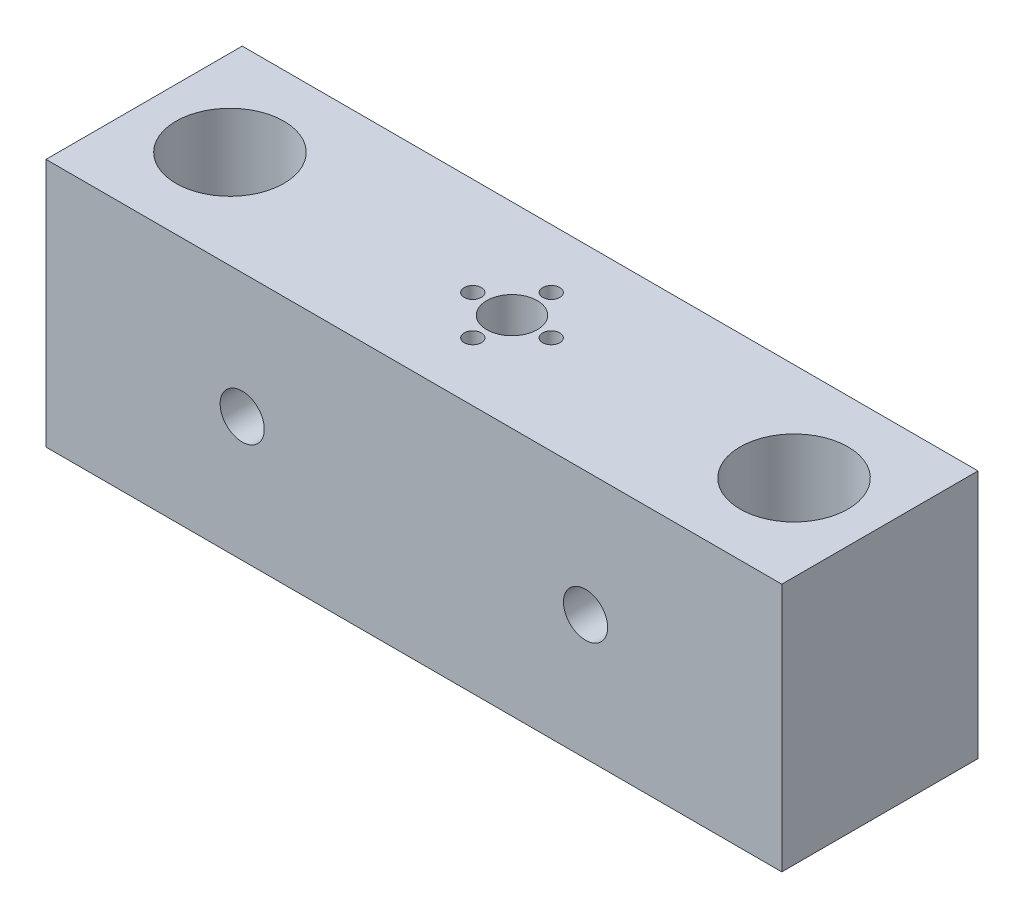
ISO-10303-21;
HEADER;
FILE_DESCRIPTION(('STEP AP214'),'2;1');
FILE_NAME('part.step','',(''),(''),'','','');
FILE_SCHEMA(('AUTOMOTIVE_DESIGN { 1 0 10303 214 1 1 1 1 }'));
ENDSEC;
DATA;
#1=APPLICATION_CONTEXT('core data for automotive mechanical design processes');
#2=APPLICATION_PROTOCOL_DEFINITION('international standard','automotive_design',2000,#1);
#3=PRODUCT_CONTEXT('',#1,'mechanical');
#4=PRODUCT('Part','Part','',(#3));
#5=PRODUCT_RELATED_PRODUCT_CATEGORY('part','',(#4));
#6=PRODUCT_DEFINITION_FORMATION('','',#4);
#7=PRODUCT_DEFINITION_CONTEXT('part definition',#1,'design');
#8=PRODUCT_DEFINITION('design','',#6,#7);
#9=PRODUCT_DEFINITION_SHAPE('','',#8);
#10=(LENGTH_UNIT() NAMED_UNIT(*) SI_UNIT(.MILLI.,.METRE.));
#11=(NAMED_UNIT(*) PLANE_ANGLE_UNIT() SI_UNIT($,.RADIAN.));
#12=(NAMED_UNIT(*) SI_UNIT($,.STERADIAN.) SOLID_ANGLE_UNIT());
#13=UNCERTAINTY_MEASURE_WITH_UNIT(LENGTH_MEASURE(1.E-05),#10,'distance_accuracy_value','');
#14=(GEOMETRIC_REPRESENTATION_CONTEXT(3) GLOBAL_UNCERTAINTY_ASSIGNED_CONTEXT((#13)) GLOBAL_UNIT_ASSIGNED_CONTEXT((#10,
#11,#12)) REPRESENTATION_CONTEXT('',''));
#15=CARTESIAN_POINT('',(0.,0.,0.));
#16=DIRECTION('',(0.,0.,1.));
#17=DIRECTION('',(1.,0.,0.));
#18=AXIS2_PLACEMENT_3D('',#15,#16,#17);
#19=CARTESIAN_POINT('',(0.,50.8,0.));
#20=DIRECTION('',(0.,1.,0.));
#21=DIRECTION('',(0.,0.,1.));
#22=AXIS2_PLACEMENT_3D('',#19,#20,#21);
#23=PLANE('',#22);
#24=CARTESIAN_POINT('',(-8.,50.8,0.));
#25=DIRECTION('',(0.,1.,0.));
#26=DIRECTION('',(1.,0.,0.));
#27=AXIS2_PLACEMENT_3D('',#24,#25,#26);
#28=CIRCLE('',#27,1.75);
#29=CARTESIAN_POINT('',(-6.25,50.8,0.));
#30=VERTEX_POINT('',#29);
#31=EDGE_CURVE('E155',#30,#30,#28,.T.);
#32=ORIENTED_EDGE('',*,*,#31,.F.);
#33=EDGE_LOOP('',(#32));
#34=FACE_BOUND('',#33,.T.);
#35=CARTESIAN_POINT('',(0.,50.8,8.));
#36=DIRECTION('',(0.,1.,0.));
#37=DIRECTION('',(0.,0.,-1.));
#38=AXIS2_PLACEMENT_3D('',#35,#36,#37);
#39=CIRCLE('',#38,1.75);
#40=CARTESIAN_POINT('',(0.,50.8,6.25));
#41=VERTEX_POINT('',#40);
#42=EDGE_CURVE('E149',#41,#41,#39,.T.);
#43=ORIENTED_EDGE('',*,*,#42,.F.);
#44=EDGE_LOOP('',(#43));
#45=FACE_BOUND('',#44,.T.);
#46=CARTESIAN_POINT('',(8.,50.8,0.));
#47=DIRECTION('',(0.,1.,0.));
#48=DIRECTION('',(-1.,0.,0.));
#49=AXIS2_PLACEMENT_3D('',#46,#47,#48);
#50=CIRCLE('',#49,1.75);
#51=CARTESIAN_POINT('',(6.25,50.8,0.));
#52=VERTEX_POINT('',#51);
#53=EDGE_CURVE('E142',#52,#52,#50,.T.);
#54=ORIENTED_EDGE('',*,*,#53,.F.);
#55=EDGE_LOOP('',(#54));
#56=FACE_BOUND('',#55,.T.);
#57=CARTESIAN_POINT('',(0.,50.8,-8.));
#58=DIRECTION('',(0.,1.,0.));
#59=DIRECTION('',(0.,0.,1.));
#60=AXIS2_PLACEMENT_3D('',#57,#58,#59);
#61=CIRCLE('',#60,1.75);
#62=CARTESIAN_POINT('',(0.,50.8,-6.25));
#63=VERTEX_POINT('',#62);
#64=EDGE_CURVE('E136',#63,#63,#61,.T.);
#65=ORIENTED_EDGE('',*,*,#64,.F.);
#66=EDGE_LOOP('',(#65));
#67=FACE_BOUND('',#66,.T.);
#68=CARTESIAN_POINT('',(-57.5,50.8,0.));
#69=DIRECTION('',(0.,1.,0.));
#70=DIRECTION('',(0.,0.,1.));
#71=AXIS2_PLACEMENT_3D('',#68,#69,#70);
#72=CIRCLE('',#71,11.);
#73=CARTESIAN_POINT('',(-57.5,50.8,-11.));
#74=VERTEX_POINT('',#73);
#75=EDGE_CURVE('E123',#74,#74,#72,.F.);
#76=ORIENTED_EDGE('',*,*,#75,.T.);
#77=EDGE_LOOP('',(#76));
#78=FACE_BOUND('',#77,.T.);
#79=DIRECTION('',(0.,0.,-1.));
#80=VECTOR('',#79,1.);
#81=CARTESIAN_POINT('',(75.,50.8,-20.));
#82=LINE('',#81,#80);
#83=CARTESIAN_POINT('',(75.,50.8,20.));
#84=VERTEX_POINT('',#83);
#85=CARTESIAN_POINT('',(75.,50.8,-20.));
#86=VERTEX_POINT('',#85);
#87=EDGE_CURVE('E91',#84,#86,#82,.T.);
#88=ORIENTED_EDGE('',*,*,#87,.T.);
#89=DIRECTION('',(-1.,0.,0.));
#90=VECTOR('',#89,1.);
#91=CARTESIAN_POINT('',(-75.,50.8,-20.));
#92=LINE('',#91,#90);
#93=CARTESIAN_POINT('',(-75.,50.8,-20.));
#94=VERTEX_POINT('',#93);
#95=EDGE_CURVE('E86',#86,#94,#92,.T.);
#96=ORIENTED_EDGE('',*,*,#95,.T.);
#97=DIRECTION('',(0.,0.,1.));
#98=VECTOR('',#97,1.);
#99=CARTESIAN_POINT('',(-75.,50.8,-20.));
#100=LINE('',#99,#98);
#101=CARTESIAN_POINT('',(-75.,50.8,20.));
#102=VERTEX_POINT('',#101);
#103=EDGE_CURVE('E89',#94,#102,#100,.T.);
#104=ORIENTED_EDGE('',*,*,#103,.T.);
#105=DIRECTION('',(1.,0.,0.));
#106=VECTOR('',#105,1.);
#107=CARTESIAN_POINT('',(-75.,50.8,20.));
#108=LINE('',#107,#106);
#109=EDGE_CURVE('E56',#102,#84,#108,.T.);
#110=ORIENTED_EDGE('',*,*,#109,.T.);
#111=EDGE_LOOP('',(#88,#96,#104,#110));
#112=FACE_BOUND('',#111,.T.);
#113=CARTESIAN_POINT('',(0.,50.8,0.));
#114=DIRECTION('',(0.,1.,0.));
#115=DIRECTION('',(0.,0.,1.));
#116=AXIS2_PLACEMENT_3D('',#113,#114,#115);
#117=CIRCLE('',#116,5.15);
#118=CARTESIAN_POINT('',(0.,50.8,-5.15));
#119=VERTEX_POINT('',#118);
#120=EDGE_CURVE('E106',#119,#119,#117,.F.);
#121=ORIENTED_EDGE('',*,*,#120,.T.);
#122=EDGE_LOOP('',(#121));
#123=FACE_BOUND('',#122,.T.);
#124=CARTESIAN_POINT('',(57.5,50.8,0.));
#125=DIRECTION('',(0.,1.,0.));
#126=DIRECTION('',(0.,0.,1.));
#127=AXIS2_PLACEMENT_3D('',#124,#125,#126);
#128=CIRCLE('',#127,11.);
#129=CARTESIAN_POINT('',(57.5,50.8,-11.));
#130=VERTEX_POINT('',#129);
#131=EDGE_CURVE('E129',#130,#130,#128,.F.);
#132=ORIENTED_EDGE('',*,*,#131,.T.);
#133=EDGE_LOOP('',(#132));
#134=FACE_BOUND('',#133,.T.);
#135=ADVANCED_FACE('F39',(#34,#45,#56,#67,#78,#112,#123,#134),#23,.T.);
#136=CARTESIAN_POINT('',(0.,0.,0.));
#137=DIRECTION('',(0.,1.,0.));
#138=DIRECTION('',(0.,0.,1.));
#139=AXIS2_PLACEMENT_3D('',#136,#137,#138);
#140=PLANE('',#139);
#141=CARTESIAN_POINT('',(-8.,0.,0.));
#142=DIRECTION('',(0.,1.,0.));
#143=DIRECTION('',(1.,0.,0.));
#144=AXIS2_PLACEMENT_3D('',#141,#142,#143);
#145=CIRCLE('',#144,1.75);
#146=CARTESIAN_POINT('',(-6.25,0.,0.));
#147=VERTEX_POINT('',#146);
#148=EDGE_CURVE('E139',#147,#147,#145,.T.);
#149=ORIENTED_EDGE('',*,*,#148,.T.);
#150=EDGE_LOOP('',(#149));
#151=FACE_BOUND('',#150,.T.);
#152=CARTESIAN_POINT('',(0.,0.,8.));
#153=DIRECTION('',(0.,1.,0.));
#154=DIRECTION('',(0.,0.,-1.));
#155=AXIS2_PLACEMENT_3D('',#152,#153,#154);
#156=CIRCLE('',#155,1.75);
#157=CARTESIAN_POINT('',(0.,0.,6.25));
#158=VERTEX_POINT('',#157);
#159=EDGE_CURVE('E152',#158,#158,#156,.T.);
#160=ORIENTED_EDGE('',*,*,#159,.T.);
#161=EDGE_LOOP('',(#160));
#162=FACE_BOUND('',#161,.T.);
#163=CARTESIAN_POINT('',(8.,0.,0.));
#164=DIRECTION('',(0.,1.,0.));
#165=DIRECTION('',(-1.,0.,0.));
#166=AXIS2_PLACEMENT_3D('',#163,#164,#165);
#167=CIRCLE('',#166,1.75);
#168=CARTESIAN_POINT('',(6.25,0.,0.));
#169=VERTEX_POINT('',#168);
#170=EDGE_CURVE('E145',#169,#169,#167,.T.);
#171=ORIENTED_EDGE('',*,*,#170,.T.);
#172=EDGE_LOOP('',(#171));
#173=FACE_BOUND('',#172,.T.);
#174=CARTESIAN_POINT('',(0.,0.,-8.));
#175=DIRECTION('',(0.,1.,0.));
#176=DIRECTION('',(0.,0.,1.));
#177=AXIS2_PLACEMENT_3D('',#174,#175,#176);
#178=CIRCLE('',#177,1.75);
#179=CARTESIAN_POINT('',(0.,0.,-6.25));
#180=VERTEX_POINT('',#179);
#181=EDGE_CURVE('E135',#180,#180,#178,.T.);
#182=ORIENTED_EDGE('',*,*,#181,.T.);
#183=EDGE_LOOP('',(#182));
#184=FACE_BOUND('',#183,.T.);
#185=DIRECTION('',(0.,0.,-1.));
#186=VECTOR('',#185,1.);
#187=CARTESIAN_POINT('',(75.,0.,-20.));
#188=LINE('',#187,#186);
#189=CARTESIAN_POINT('',(75.,0.,20.));
#190=VERTEX_POINT('',#189);
#191=CARTESIAN_POINT('',(75.,0.,-20.));
#192=VERTEX_POINT('',#191);
#193=EDGE_CURVE('E103',#190,#192,#188,.T.);
#194=ORIENTED_EDGE('',*,*,#193,.F.);
#195=DIRECTION('',(1.,0.,0.));
#196=VECTOR('',#195,1.);
#197=CARTESIAN_POINT('',(-75.,0.,20.));
#198=LINE('',#197,#196);
#199=CARTESIAN_POINT('',(-75.,0.,20.));
#200=VERTEX_POINT('',#199);
#201=EDGE_CURVE('E79',#200,#190,#198,.T.);
#202=ORIENTED_EDGE('',*,*,#201,.F.);
#203=DIRECTION('',(0.,0.,1.));
#204=VECTOR('',#203,1.);
#205=CARTESIAN_POINT('',(-75.,0.,-20.));
#206=LINE('',#205,#204);
#207=CARTESIAN_POINT('',(-75.,0.,-20.));
#208=VERTEX_POINT('',#207);
#209=EDGE_CURVE('E73',#208,#200,#206,.T.);
#210=ORIENTED_EDGE('',*,*,#209,.F.);
#211=DIRECTION('',(-1.,0.,0.));
#212=VECTOR('',#211,1.);
#213=CARTESIAN_POINT('',(-75.,0.,-20.));
#214=LINE('',#213,#212);
#215=EDGE_CURVE('E95',#192,#208,#214,.T.);
#216=ORIENTED_EDGE('',*,*,#215,.F.);
#217=EDGE_LOOP('',(#194,#202,#210,#216));
#218=FACE_BOUND('',#217,.T.);
#219=CARTESIAN_POINT('',(0.,0.,0.));
#220=DIRECTION('',(0.,1.,0.));
#221=DIRECTION('',(0.,0.,1.));
#222=AXIS2_PLACEMENT_3D('',#219,#220,#221);
#223=CIRCLE('',#222,5.15);
#224=CARTESIAN_POINT('',(0.,0.,-5.15));
#225=VERTEX_POINT('',#224);
#226=EDGE_CURVE('E120',#225,#225,#223,.T.);
#227=ORIENTED_EDGE('',*,*,#226,.T.);
#228=EDGE_LOOP('',(#227));
#229=FACE_BOUND('',#228,.T.);
#230=CARTESIAN_POINT('',(-57.5,0.,0.));
#231=DIRECTION('',(0.,1.,0.));
#232=DIRECTION('',(0.,0.,1.));
#233=AXIS2_PLACEMENT_3D('',#230,#231,#232);
#234=CIRCLE('',#233,11.);
#235=CARTESIAN_POINT('',(-57.5,0.,-11.));
#236=VERTEX_POINT('',#235);
#237=EDGE_CURVE('E126',#236,#236,#234,.T.);
#238=ORIENTED_EDGE('',*,*,#237,.T.);
#239=EDGE_LOOP('',(#238));
#240=FACE_BOUND('',#239,.T.);
#241=CARTESIAN_POINT('',(57.5,0.,0.));
#242=DIRECTION('',(0.,1.,0.));
#243=DIRECTION('',(0.,0.,1.));
#244=AXIS2_PLACEMENT_3D('',#241,#242,#243);
#245=CIRCLE('',#244,11.);
#246=CARTESIAN_POINT('',(57.5,0.,-11.));
#247=VERTEX_POINT('',#246);
#248=EDGE_CURVE('E132',#247,#247,#245,.T.);
#249=ORIENTED_EDGE('',*,*,#248,.T.);
#250=EDGE_LOOP('',(#249));
#251=FACE_BOUND('',#250,.T.);
#252=ADVANCED_FACE('F114',(#151,#162,#173,#184,#218,#229,#240,#251),#140,.F.);
#253=CARTESIAN_POINT('',(75.,50.8,-20.));
#254=DIRECTION('',(-1.,0.,0.));
#255=DIRECTION('',(0.,0.,1.));
#256=AXIS2_PLACEMENT_3D('',#253,#254,#255);
#257=PLANE('',#256);
#258=ORIENTED_EDGE('',*,*,#193,.T.);
#259=DIRECTION('',(0.,-1.,0.));
#260=VECTOR('',#259,1.);
#261=CARTESIAN_POINT('',(75.,50.8,-20.));
#262=LINE('',#261,#260);
#263=EDGE_CURVE('E11',#86,#192,#262,.T.);
#264=ORIENTED_EDGE('',*,*,#263,.F.);
#265=ORIENTED_EDGE('',*,*,#87,.F.);
#266=DIRECTION('',(0.,-1.,0.));
#267=VECTOR('',#266,1.);
#268=CARTESIAN_POINT('',(75.,50.8,20.));
#269=LINE('',#268,#267);
#270=EDGE_CURVE('E99',#84,#190,#269,.T.);
#271=ORIENTED_EDGE('',*,*,#270,.T.);
#272=EDGE_LOOP('',(#258,#264,#265,#271));
#273=FACE_BOUND('',#272,.T.);
#274=ADVANCED_FACE('F41',(#273),#257,.F.);
#275=CARTESIAN_POINT('',(-75.,50.8,-20.));
#276=DIRECTION('',(0.,0.,1.));
#277=DIRECTION('',(1.,0.,0.));
#278=AXIS2_PLACEMENT_3D('',#275,#276,#277);
#279=PLANE('',#278);
#280=CARTESIAN_POINT('',(-35.,25.4,-20.));
#281=DIRECTION('',(0.,0.,-1.));
#282=DIRECTION('',(-1.,0.,0.));
#283=AXIS2_PLACEMENT_3D('',#280,#281,#282);
#284=CIRCLE('',#283,5.025);
#285=CARTESIAN_POINT('',(-40.025,25.4,-20.));
#286=VERTEX_POINT('',#285);
#287=EDGE_CURVE('E174',#286,#286,#284,.T.);
#288=ORIENTED_EDGE('',*,*,#287,.F.);
#289=EDGE_LOOP('',(#288));
#290=FACE_BOUND('',#289,.T.);
#291=CARTESIAN_POINT('',(35.,25.4,-20.));
#292=DIRECTION('',(0.,0.,-1.));
#293=DIRECTION('',(-1.,0.,0.));
#294=AXIS2_PLACEMENT_3D('',#291,#292,#293);
#295=CIRCLE('',#294,5.025);
#296=CARTESIAN_POINT('',(29.975,25.4,-20.));
#297=VERTEX_POINT('',#296);
#298=EDGE_CURVE('E165',#297,#297,#295,.T.);
#299=ORIENTED_EDGE('',*,*,#298,.F.);
#300=EDGE_LOOP('',(#299));
#301=FACE_BOUND('',#300,.T.);
#302=ORIENTED_EDGE('',*,*,#215,.T.);
#303=DIRECTION('',(0.,-1.,0.));
#304=VECTOR('',#303,1.);
#305=CARTESIAN_POINT('',(-75.,50.8,-20.));
#306=LINE('',#305,#304);
#307=EDGE_CURVE('E48',#94,#208,#306,.T.);
#308=ORIENTED_EDGE('',*,*,#307,.F.);
#309=ORIENTED_EDGE('',*,*,#95,.F.);
#310=ORIENTED_EDGE('',*,*,#263,.T.);
#311=EDGE_LOOP('',(#302,#308,#309,#310));
#312=FACE_BOUND('',#311,.T.);
#313=ADVANCED_FACE('F94',(#290,#301,#312),#279,.F.);
#314=CARTESIAN_POINT('',(-75.,50.8,-20.));
#315=DIRECTION('',(1.,0.,0.));
#316=DIRECTION('',(0.,0.,-1.));
#317=AXIS2_PLACEMENT_3D('',#314,#315,#316);
#318=PLANE('',#317);
#319=ORIENTED_EDGE('',*,*,#209,.T.);
#320=DIRECTION('',(0.,-1.,0.));
#321=VECTOR('',#320,1.);
#322=CARTESIAN_POINT('',(-75.,50.8,20.));
#323=LINE('',#322,#321);
#324=EDGE_CURVE('E96',#102,#200,#323,.T.);
#325=ORIENTED_EDGE('',*,*,#324,.F.);
#326=ORIENTED_EDGE('',*,*,#103,.F.);
#327=ORIENTED_EDGE('',*,*,#307,.T.);
#328=EDGE_LOOP('',(#319,#325,#326,#327));
#329=FACE_BOUND('',#328,.T.);
#330=ADVANCED_FACE('F97',(#329),#318,.F.);
#331=CARTESIAN_POINT('',(-75.,50.8,20.));
#332=DIRECTION('',(0.,0.,-1.));
#333=DIRECTION('',(-1.,0.,0.));
#334=AXIS2_PLACEMENT_3D('',#331,#332,#333);
#335=PLANE('',#334);
#336=CARTESIAN_POINT('',(-35.,25.4,20.));
#337=DIRECTION('',(0.,0.,-1.));
#338=DIRECTION('',(-1.,0.,0.));
#339=AXIS2_PLACEMENT_3D('',#336,#337,#338);
#340=CIRCLE('',#339,4.49999999999998);
#341=CARTESIAN_POINT('',(-39.5,25.4,20.));
#342=VERTEX_POINT('',#341);
#343=EDGE_CURVE('E168',#342,#342,#340,.T.);
#344=ORIENTED_EDGE('',*,*,#343,.T.);
#345=EDGE_LOOP('',(#344));
#346=FACE_BOUND('',#345,.T.);
#347=CARTESIAN_POINT('',(35.,25.4,20.));
#348=DIRECTION('',(0.,0.,-1.));
#349=DIRECTION('',(-1.,0.,0.));
#350=AXIS2_PLACEMENT_3D('',#347,#348,#349);
#351=CIRCLE('',#350,4.49999999999998);
#352=CARTESIAN_POINT('',(30.5,25.4,20.));
#353=VERTEX_POINT('',#352);
#354=EDGE_CURVE('E146',#353,#353,#351,.T.);
#355=ORIENTED_EDGE('',*,*,#354,.T.);
#356=EDGE_LOOP('',(#355));
#357=FACE_BOUND('',#356,.T.);
#358=ORIENTED_EDGE('',*,*,#201,.T.);
#359=ORIENTED_EDGE('',*,*,#270,.F.);
#360=ORIENTED_EDGE('',*,*,#109,.F.);
#361=ORIENTED_EDGE('',*,*,#324,.T.);
#362=EDGE_LOOP('',(#358,#359,#360,#361));
#363=FACE_BOUND('',#362,.T.);
#364=ADVANCED_FACE('F111',(#346,#357,#363),#335,.F.);
#365=CARTESIAN_POINT('',(0.,50.800012,0.));
#366=DIRECTION('',(0.,-1.,0.));
#367=DIRECTION('',(0.,0.,-1.));
#368=AXIS2_PLACEMENT_3D('',#365,#366,#367);
#369=CYLINDRICAL_SURFACE('',#368,5.15);
#370=CARTESIAN_POINT('',(0.,50.8,-5.15));
#371=CARTESIAN_POINT('',(0.,50.2708333333333,-5.15));
#372=CARTESIAN_POINT('',(0.,49.7416666666667,-5.15));
#373=CARTESIAN_POINT('',(0.,48.6833333333333,-5.15));
#374=CARTESIAN_POINT('',(0.,48.1541666666667,-5.15));
#375=CARTESIAN_POINT('',(0.,47.0958333333333,-5.15));
#376=CARTESIAN_POINT('',(0.,46.5666666666667,-5.15));
#377=CARTESIAN_POINT('',(0.,45.5083333333333,-5.15));
#378=CARTESIAN_POINT('',(0.,44.9791666666667,-5.15));
#379=CARTESIAN_POINT('',(0.,43.9208333333333,-5.15));
#380=CARTESIAN_POINT('',(0.,43.3916666666667,-5.15));
#381=CARTESIAN_POINT('',(0.,42.3333333333333,-5.15));
#382=CARTESIAN_POINT('',(0.,41.8041666666667,-5.15));
#383=CARTESIAN_POINT('',(0.,40.7458333333333,-5.15));
#384=CARTESIAN_POINT('',(0.,40.2166666666667,-5.15));
#385=CARTESIAN_POINT('',(0.,39.1583333333333,-5.15));
#386=CARTESIAN_POINT('',(0.,38.6291666666667,-5.15));
#387=CARTESIAN_POINT('',(0.,37.5708333333333,-5.15));
#388=CARTESIAN_POINT('',(0.,37.0416666666667,-5.15));
#389=CARTESIAN_POINT('',(0.,35.9833333333333,-5.15));
#390=CARTESIAN_POINT('',(0.,35.4541666666667,-5.15));
#391=CARTESIAN_POINT('',(0.,34.3958333333333,-5.15));
#392=CARTESIAN_POINT('',(0.,33.8666666666667,-5.15));
#393=CARTESIAN_POINT('',(0.,32.8083333333333,-5.15));
#394=CARTESIAN_POINT('',(0.,32.2791666666667,-5.15));
#395=CARTESIAN_POINT('',(0.,31.2208333333333,-5.15));
#396=CARTESIAN_POINT('',(0.,30.6916666666667,-5.15));
#397=CARTESIAN_POINT('',(0.,29.6333333333333,-5.15));
#398=CARTESIAN_POINT('',(0.,29.1041666666667,-5.15));
#399=CARTESIAN_POINT('',(0.,28.0458333333333,-5.15));
#400=CARTESIAN_POINT('',(0.,27.5166666666667,-5.15));
#401=CARTESIAN_POINT('',(0.,26.4583333333333,-5.15));
#402=CARTESIAN_POINT('',(0.,25.9291666666667,-5.15));
#403=CARTESIAN_POINT('',(0.,24.8708333333333,-5.15));
#404=CARTESIAN_POINT('',(0.,24.3416666666667,-5.15));
#405=CARTESIAN_POINT('',(0.,23.2833333333333,-5.15));
#406=CARTESIAN_POINT('',(0.,22.7541666666667,-5.15));
#407=CARTESIAN_POINT('',(0.,21.6958333333333,-5.15));
#408=CARTESIAN_POINT('',(0.,21.1666666666667,-5.15));
#409=CARTESIAN_POINT('',(0.,20.1083333333333,-5.15));
#410=CARTESIAN_POINT('',(0.,19.5791666666667,-5.15));
#411=CARTESIAN_POINT('',(0.,18.5208333333333,-5.15));
#412=CARTESIAN_POINT('',(0.,17.9916666666667,-5.15));
#413=CARTESIAN_POINT('',(0.,16.9333333333333,-5.15));
#414=CARTESIAN_POINT('',(0.,16.4041666666667,-5.15));
#415=CARTESIAN_POINT('',(0.,15.3458333333333,-5.15));
#416=CARTESIAN_POINT('',(0.,14.8166666666667,-5.15));
#417=CARTESIAN_POINT('',(0.,13.7583333333333,-5.15));
#418=CARTESIAN_POINT('',(0.,13.2291666666667,-5.15));
#419=CARTESIAN_POINT('',(0.,12.1708333333333,-5.15));
#420=CARTESIAN_POINT('',(0.,11.6416666666667,-5.15));
#421=CARTESIAN_POINT('',(0.,10.5833333333333,-5.15));
#422=CARTESIAN_POINT('',(0.,10.0541666666667,-5.15));
#423=CARTESIAN_POINT('',(0.,8.99583333333333,-5.15));
#424=CARTESIAN_POINT('',(0.,8.46666666666667,-5.15));
#425=CARTESIAN_POINT('',(0.,7.40833333333333,-5.15));
#426=CARTESIAN_POINT('',(0.,6.87916666666667,-5.15));
#427=CARTESIAN_POINT('',(0.,5.82083333333333,-5.15));
#428=CARTESIAN_POINT('',(0.,5.29166666666667,-5.15));
#429=CARTESIAN_POINT('',(0.,4.23333333333333,-5.15));
#430=CARTESIAN_POINT('',(0.,3.70416666666667,-5.15));
#431=CARTESIAN_POINT('',(0.,2.64583333333333,-5.15));
#432=CARTESIAN_POINT('',(0.,2.11666666666666,-5.15));
#433=CARTESIAN_POINT('',(0.,1.05833333333333,-5.15));
#434=CARTESIAN_POINT('',(0.,0.529166666666666,-5.15));
#435=CARTESIAN_POINT('',(0.,0.,-5.15));
#436=B_SPLINE_CURVE_WITH_KNOTS('',3,(#370,#371,#372,#373,#374,#375,#376,#377,#378,#379,#380,
#381,#382,#383,#384,#385,#386,#387,#388,#389,#390,#391,#392,#393,#394,#395,#396,#397,#398,#399,
#400,#401,#402,#403,#404,#405,#406,#407,#408,#409,#410,#411,#412,#413,#414,#415,#416,#417,#418,
#419,#420,#421,#422,#423,#424,#425,#426,#427,#428,#429,#430,#431,#432,#433,#434,#435),
.UNSPECIFIED.,.F.,.F.,(4,2,2,2,2,2,2,2,2,2,2,2,2,2,2,2,2,2,2,2,2,2,2,2,2,2,2,2,2,2,2,2,4),(0.,
1.5875,3.175,4.7625,6.34999999999999,7.93749999999999,9.52499999999999,11.1125,12.7,14.2875,
15.875,17.4625,19.05,20.6375,22.225,23.8125,25.4,26.9875,28.575,30.1625,31.75,33.3375,34.925,
36.5125,38.1,39.6875,41.275,42.8625,44.45,46.0375,47.625,49.2125,50.8),.UNSPECIFIED.);
#437=EDGE_CURVE('BSEAM211',#119,#225,#436,.T.);
#438=ORIENTED_EDGE('',*,*,#120,.F.);
#439=ORIENTED_EDGE('',*,*,#226,.F.);
#440=ORIENTED_EDGE('',*,*,#437,.T.);
#441=ORIENTED_EDGE('',*,*,#437,.F.);
#442=EDGE_LOOP('',(#438,#440,#439,#441));
#443=FACE_BOUND('',#442,.T.);
#444=ADVANCED_FACE('F211',(#443),#369,.F.);
#445=CARTESIAN_POINT('',(-57.5,50.800012,0.));
#446=DIRECTION('',(0.,-1.,0.));
#447=DIRECTION('',(0.,0.,-1.));
#448=AXIS2_PLACEMENT_3D('',#445,#446,#447);
#449=CYLINDRICAL_SURFACE('',#448,11.);
#450=CARTESIAN_POINT('',(-57.5,50.8,-11.));
#451=CARTESIAN_POINT('',(-57.5,50.2708333333333,-11.));
#452=CARTESIAN_POINT('',(-57.5,49.7416666666667,-11.));
#453=CARTESIAN_POINT('',(-57.5,48.6833333333333,-11.));
#454=CARTESIAN_POINT('',(-57.5,48.1541666666667,-11.));
#455=CARTESIAN_POINT('',(-57.5,47.0958333333333,-11.));
#456=CARTESIAN_POINT('',(-57.5,46.5666666666667,-11.));
#457=CARTESIAN_POINT('',(-57.5,45.5083333333333,-11.));
#458=CARTESIAN_POINT('',(-57.5,44.9791666666667,-11.));
#459=CARTESIAN_POINT('',(-57.5,43.9208333333333,-11.));
#460=CARTESIAN_POINT('',(-57.5,43.3916666666667,-11.));
#461=CARTESIAN_POINT('',(-57.5,42.3333333333333,-11.));
#462=CARTESIAN_POINT('',(-57.5,41.8041666666667,-11.));
#463=CARTESIAN_POINT('',(-57.5,40.7458333333333,-11.));
#464=CARTESIAN_POINT('',(-57.5,40.2166666666667,-11.));
#465=CARTESIAN_POINT('',(-57.5,39.1583333333333,-11.));
#466=CARTESIAN_POINT('',(-57.5,38.6291666666667,-11.));
#467=CARTESIAN_POINT('',(-57.5,37.5708333333333,-11.));
#468=CARTESIAN_POINT('',(-57.5,37.0416666666667,-11.));
#469=CARTESIAN_POINT('',(-57.5,35.9833333333333,-11.));
#470=CARTESIAN_POINT('',(-57.5,35.4541666666667,-11.));
#471=CARTESIAN_POINT('',(-57.5,34.3958333333333,-11.));
#472=CARTESIAN_POINT('',(-57.5,33.8666666666667,-11.));
#473=CARTESIAN_POINT('',(-57.5,32.8083333333333,-11.));
#474=CARTESIAN_POINT('',(-57.5,32.2791666666667,-11.));
#475=CARTESIAN_POINT('',(-57.5,31.2208333333333,-11.));
#476=CARTESIAN_POINT('',(-57.5,30.6916666666667,-11.));
#477=CARTESIAN_POINT('',(-57.5,29.6333333333333,-11.));
#478=CARTESIAN_POINT('',(-57.5,29.1041666666667,-11.));
#479=CARTESIAN_POINT('',(-57.5,28.0458333333333,-11.));
#480=CARTESIAN_POINT('',(-57.5,27.5166666666667,-11.));
#481=CARTESIAN_POINT('',(-57.5,26.4583333333333,-11.));
#482=CARTESIAN_POINT('',(-57.5,25.9291666666667,-11.));
#483=CARTESIAN_POINT('',(-57.5,24.8708333333333,-11.));
#484=CARTESIAN_POINT('',(-57.5,24.3416666666667,-11.));
#485=CARTESIAN_POINT('',(-57.5,23.2833333333333,-11.));
#486=CARTESIAN_POINT('',(-57.5,22.7541666666667,-11.));
#487=CARTESIAN_POINT('',(-57.5,21.6958333333333,-11.));
#488=CARTESIAN_POINT('',(-57.5,21.1666666666667,-11.));
#489=CARTESIAN_POINT('',(-57.5,20.1083333333333,-11.));
#490=CARTESIAN_POINT('',(-57.5,19.5791666666667,-11.));
#491=CARTESIAN_POINT('',(-57.5,18.5208333333333,-11.));
#492=CARTESIAN_POINT('',(-57.5,17.9916666666667,-11.));
#493=CARTESIAN_POINT('',(-57.5,16.9333333333333,-11.));
#494=CARTESIAN_POINT('',(-57.5,16.4041666666667,-11.));
#495=CARTESIAN_POINT('',(-57.5,15.3458333333333,-11.));
#496=CARTESIAN_POINT('',(-57.5,14.8166666666667,-11.));
#497=CARTESIAN_POINT('',(-57.5,13.7583333333333,-11.));
#498=CARTESIAN_POINT('',(-57.5,13.2291666666667,-11.));
#499=CARTESIAN_POINT('',(-57.5,12.1708333333333,-11.));
#500=CARTESIAN_POINT('',(-57.5,11.6416666666667,-11.));
#501=CARTESIAN_POINT('',(-57.5,10.5833333333333,-11.));
#502=CARTESIAN_POINT('',(-57.5,10.0541666666667,-11.));
#503=CARTESIAN_POINT('',(-57.5,8.99583333333333,-11.));
#504=CARTESIAN_POINT('',(-57.5,8.46666666666667,-11.));
#505=CARTESIAN_POINT('',(-57.5,7.40833333333333,-11.));
#506=CARTESIAN_POINT('',(-57.5,6.87916666666667,-11.));
#507=CARTESIAN_POINT('',(-57.5,5.82083333333333,-11.));
#508=CARTESIAN_POINT('',(-57.5,5.29166666666667,-11.));
#509=CARTESIAN_POINT('',(-57.5,4.23333333333333,-11.));
#510=CARTESIAN_POINT('',(-57.5,3.70416666666667,-11.));
#511=CARTESIAN_POINT('',(-57.5,2.64583333333333,-11.));
#512=CARTESIAN_POINT('',(-57.5,2.11666666666666,-11.));
#513=CARTESIAN_POINT('',(-57.5,1.05833333333333,-11.));
#514=CARTESIAN_POINT('',(-57.5,0.529166666666666,-11.));
#515=CARTESIAN_POINT('',(-57.5,0.,-11.));
#516=B_SPLINE_CURVE_WITH_KNOTS('',3,(#450,#451,#452,#453,#454,#455,#456,#457,#458,#459,#460,
#461,#462,#463,#464,#465,#466,#467,#468,#469,#470,#471,#472,#473,#474,#475,#476,#477,#478,#479,
#480,#481,#482,#483,#484,#485,#486,#487,#488,#489,#490,#491,#492,#493,#494,#495,#496,#497,#498,
#499,#500,#501,#502,#503,#504,#505,#506,#507,#508,#509,#510,#511,#512,#513,#514,#515),
.UNSPECIFIED.,.F.,.F.,(4,2,2,2,2,2,2,2,2,2,2,2,2,2,2,2,2,2,2,2,2,2,2,2,2,2,2,2,2,2,2,2,4),(0.,
1.5875,3.175,4.7625,6.34999999999999,7.93749999999999,9.52499999999999,11.1125,12.7,14.2875,
15.875,17.4625,19.05,20.6375,22.225,23.8125,25.4,26.9875,28.575,30.1625,31.75,33.3375,34.925,
36.5125,38.1,39.6875,41.275,42.8625,44.45,46.0375,47.625,49.2125,50.8),.UNSPECIFIED.);
#517=EDGE_CURVE('BSEAM235',#74,#236,#516,.T.);
#518=ORIENTED_EDGE('',*,*,#75,.F.);
#519=ORIENTED_EDGE('',*,*,#237,.F.);
#520=ORIENTED_EDGE('',*,*,#517,.T.);
#521=ORIENTED_EDGE('',*,*,#517,.F.);
#522=EDGE_LOOP('',(#518,#520,#519,#521));
#523=FACE_BOUND('',#522,.T.);
#524=ADVANCED_FACE('F235',(#523),#449,.F.);
#525=CARTESIAN_POINT('',(57.5,50.800012,0.));
#526=DIRECTION('',(0.,-1.,0.));
#527=DIRECTION('',(0.,0.,-1.));
#528=AXIS2_PLACEMENT_3D('',#525,#526,#527);
#529=CYLINDRICAL_SURFACE('',#528,11.);
#530=CARTESIAN_POINT('',(57.5,50.8,-11.));
#531=CARTESIAN_POINT('',(57.5,50.2708333333333,-11.));
#532=CARTESIAN_POINT('',(57.5,49.7416666666667,-11.));
#533=CARTESIAN_POINT('',(57.5,48.6833333333333,-11.));
#534=CARTESIAN_POINT('',(57.5,48.1541666666667,-11.));
#535=CARTESIAN_POINT('',(57.5,47.0958333333333,-11.));
#536=CARTESIAN_POINT('',(57.5,46.5666666666667,-11.));
#537=CARTESIAN_POINT('',(57.5,45.5083333333333,-11.));
#538=CARTESIAN_POINT('',(57.5,44.9791666666667,-11.));
#539=CARTESIAN_POINT('',(57.5,43.9208333333333,-11.));
#540=CARTESIAN_POINT('',(57.5,43.3916666666667,-11.));
#541=CARTESIAN_POINT('',(57.5,42.3333333333333,-11.));
#542=CARTESIAN_POINT('',(57.5,41.8041666666667,-11.));
#543=CARTESIAN_POINT('',(57.5,40.7458333333333,-11.));
#544=CARTESIAN_POINT('',(57.5,40.2166666666667,-11.));
#545=CARTESIAN_POINT('',(57.5,39.1583333333333,-11.));
#546=CARTESIAN_POINT('',(57.5,38.6291666666667,-11.));
#547=CARTESIAN_POINT('',(57.5,37.5708333333333,-11.));
#548=CARTESIAN_POINT('',(57.5,37.0416666666667,-11.));
#549=CARTESIAN_POINT('',(57.5,35.9833333333333,-11.));
#550=CARTESIAN_POINT('',(57.5,35.4541666666667,-11.));
#551=CARTESIAN_POINT('',(57.5,34.3958333333333,-11.));
#552=CARTESIAN_POINT('',(57.5,33.8666666666667,-11.));
#553=CARTESIAN_POINT('',(57.5,32.8083333333333,-11.));
#554=CARTESIAN_POINT('',(57.5,32.2791666666667,-11.));
#555=CARTESIAN_POINT('',(57.5,31.2208333333333,-11.));
#556=CARTESIAN_POINT('',(57.5,30.6916666666667,-11.));
#557=CARTESIAN_POINT('',(57.5,29.6333333333333,-11.));
#558=CARTESIAN_POINT('',(57.5,29.1041666666667,-11.));
#559=CARTESIAN_POINT('',(57.5,28.0458333333333,-11.));
#560=CARTESIAN_POINT('',(57.5,27.5166666666667,-11.));
#561=CARTESIAN_POINT('',(57.5,26.4583333333333,-11.));
#562=CARTESIAN_POINT('',(57.5,25.9291666666667,-11.));
#563=CARTESIAN_POINT('',(57.5,24.8708333333333,-11.));
#564=CARTESIAN_POINT('',(57.5,24.3416666666667,-11.));
#565=CARTESIAN_POINT('',(57.5,23.2833333333333,-11.));
#566=CARTESIAN_POINT('',(57.5,22.7541666666667,-11.));
#567=CARTESIAN_POINT('',(57.5,21.6958333333333,-11.));
#568=CARTESIAN_POINT('',(57.5,21.1666666666667,-11.));
#569=CARTESIAN_POINT('',(57.5,20.1083333333333,-11.));
#570=CARTESIAN_POINT('',(57.5,19.5791666666667,-11.));
#571=CARTESIAN_POINT('',(57.5,18.5208333333333,-11.));
#572=CARTESIAN_POINT('',(57.5,17.9916666666667,-11.));
#573=CARTESIAN_POINT('',(57.5,16.9333333333333,-11.));
#574=CARTESIAN_POINT('',(57.5,16.4041666666667,-11.));
#575=CARTESIAN_POINT('',(57.5,15.3458333333333,-11.));
#576=CARTESIAN_POINT('',(57.5,14.8166666666667,-11.));
#577=CARTESIAN_POINT('',(57.5,13.7583333333333,-11.));
#578=CARTESIAN_POINT('',(57.5,13.2291666666667,-11.));
#579=CARTESIAN_POINT('',(57.5,12.1708333333333,-11.));
#580=CARTESIAN_POINT('',(57.5,11.6416666666667,-11.));
#581=CARTESIAN_POINT('',(57.5,10.5833333333333,-11.));
#582=CARTESIAN_POINT('',(57.5,10.0541666666667,-11.));
#583=CARTESIAN_POINT('',(57.5,8.99583333333333,-11.));
#584=CARTESIAN_POINT('',(57.5,8.46666666666667,-11.));
#585=CARTESIAN_POINT('',(57.5,7.40833333333333,-11.));
#586=CARTESIAN_POINT('',(57.5,6.87916666666667,-11.));
#587=CARTESIAN_POINT('',(57.5,5.82083333333333,-11.));
#588=CARTESIAN_POINT('',(57.5,5.29166666666667,-11.));
#589=CARTESIAN_POINT('',(57.5,4.23333333333333,-11.));
#590=CARTESIAN_POINT('',(57.5,3.70416666666667,-11.));
#591=CARTESIAN_POINT('',(57.5,2.64583333333333,-11.));
#592=CARTESIAN_POINT('',(57.5,2.11666666666666,-11.));
#593=CARTESIAN_POINT('',(57.5,1.05833333333333,-11.));
#594=CARTESIAN_POINT('',(57.5,0.529166666666666,-11.));
#595=CARTESIAN_POINT('',(57.5,0.,-11.));
#596=B_SPLINE_CURVE_WITH_KNOTS('',3,(#530,#531,#532,#533,#534,#535,#536,#537,#538,#539,#540,
#541,#542,#543,#544,#545,#546,#547,#548,#549,#550,#551,#552,#553,#554,#555,#556,#557,#558,#559,
#560,#561,#562,#563,#564,#565,#566,#567,#568,#569,#570,#571,#572,#573,#574,#575,#576,#577,#578,
#579,#580,#581,#582,#583,#584,#585,#586,#587,#588,#589,#590,#591,#592,#593,#594,#595),
.UNSPECIFIED.,.F.,.F.,(4,2,2,2,2,2,2,2,2,2,2,2,2,2,2,2,2,2,2,2,2,2,2,2,2,2,2,2,2,2,2,2,4),(0.,
1.5875,3.175,4.7625,6.34999999999999,7.93749999999999,9.52499999999999,11.1125,12.7,14.2875,
15.875,17.4625,19.05,20.6375,22.225,23.8125,25.4,26.9875,28.575,30.1625,31.75,33.3375,34.925,
36.5125,38.1,39.6875,41.275,42.8625,44.45,46.0375,47.625,49.2125,50.8),.UNSPECIFIED.);
#597=EDGE_CURVE('BSEAM242',#130,#247,#596,.T.);
#598=ORIENTED_EDGE('',*,*,#131,.F.);
#599=ORIENTED_EDGE('',*,*,#248,.F.);
#600=ORIENTED_EDGE('',*,*,#597,.T.);
#601=ORIENTED_EDGE('',*,*,#597,.F.);
#602=EDGE_LOOP('',(#598,#600,#599,#601));
#603=FACE_BOUND('',#602,.T.);
#604=ADVANCED_FACE('F242',(#603),#529,.F.);
#605=CARTESIAN_POINT('',(0.,0.,-8.));
#606=DIRECTION('',(0.,1.,0.));
#607=DIRECTION('',(0.,0.,1.));
#608=AXIS2_PLACEMENT_3D('',#605,#606,#607);
#609=CYLINDRICAL_SURFACE('',#608,1.75);
#610=ORIENTED_EDGE('',*,*,#181,.F.);
#611=EDGE_LOOP('',(#610));
#612=FACE_BOUND('',#611,.T.);
#613=ORIENTED_EDGE('',*,*,#64,.T.);
#614=EDGE_LOOP('',(#613));
#615=FACE_BOUND('',#614,.T.);
#616=ADVANCED_FACE('F249',(#612,#615),#609,.F.);
#617=CARTESIAN_POINT('',(8.,0.,0.));
#618=DIRECTION('',(0.,1.,0.));
#619=DIRECTION('',(0.,0.,1.));
#620=AXIS2_PLACEMENT_3D('',#617,#618,#619);
#621=CYLINDRICAL_SURFACE('',#620,1.75);
#622=ORIENTED_EDGE('',*,*,#170,.F.);
#623=EDGE_LOOP('',(#622));
#624=FACE_BOUND('',#623,.T.);
#625=ORIENTED_EDGE('',*,*,#53,.T.);
#626=EDGE_LOOP('',(#625));
#627=FACE_BOUND('',#626,.T.);
#628=ADVANCED_FACE('F257',(#624,#627),#621,.F.);
#629=CARTESIAN_POINT('',(0.,0.,8.));
#630=DIRECTION('',(0.,1.,0.));
#631=DIRECTION('',(0.,0.,1.));
#632=AXIS2_PLACEMENT_3D('',#629,#630,#631);
#633=CYLINDRICAL_SURFACE('',#632,1.75);
#634=ORIENTED_EDGE('',*,*,#159,.F.);
#635=EDGE_LOOP('',(#634));
#636=FACE_BOUND('',#635,.T.);
#637=ORIENTED_EDGE('',*,*,#42,.T.);
#638=EDGE_LOOP('',(#637));
#639=FACE_BOUND('',#638,.T.);
#640=ADVANCED_FACE('F265',(#636,#639),#633,.F.);
#641=CARTESIAN_POINT('',(-8.,0.,0.));
#642=DIRECTION('',(0.,1.,0.));
#643=DIRECTION('',(0.,0.,1.));
#644=AXIS2_PLACEMENT_3D('',#641,#642,#643);
#645=CYLINDRICAL_SURFACE('',#644,1.75);
#646=ORIENTED_EDGE('',*,*,#148,.F.);
#647=EDGE_LOOP('',(#646));
#648=FACE_BOUND('',#647,.T.);
#649=ORIENTED_EDGE('',*,*,#31,.T.);
#650=EDGE_LOOP('',(#649));
#651=FACE_BOUND('',#650,.T.);
#652=ADVANCED_FACE('F196',(#648,#651),#645,.F.);
#653=CARTESIAN_POINT('',(35.,25.4,-20.));
#654=DIRECTION('',(0.,0.,-1.));
#655=DIRECTION('',(-1.,0.,0.));
#656=AXIS2_PLACEMENT_3D('',#653,#654,#655);
#657=CYLINDRICAL_SURFACE('',#656,4.49999999999999);
#658=ORIENTED_EDGE('',*,*,#354,.F.);
#659=EDGE_LOOP('',(#658));
#660=FACE_BOUND('',#659,.T.);
#661=CARTESIAN_POINT('',(35.,25.4,-19.475));
#662=DIRECTION('',(0.,0.,-1.));
#663=DIRECTION('',(-1.,0.,0.));
#664=AXIS2_PLACEMENT_3D('',#661,#662,#663);
#665=CIRCLE('',#664,4.5);
#666=CARTESIAN_POINT('',(30.5,25.4,-19.475));
#667=VERTEX_POINT('',#666);
#668=EDGE_CURVE('E162',#667,#667,#665,.T.);
#669=ORIENTED_EDGE('',*,*,#668,.T.);
#670=EDGE_LOOP('',(#669));
#671=FACE_BOUND('',#670,.T.);
#672=ADVANCED_FACE('F187',(#660,#671),#657,.F.);
#673=CARTESIAN_POINT('',(35.,25.4,-20.));
#674=DIRECTION('',(0.,0.,-1.));
#675=DIRECTION('',(-1.,0.,0.));
#676=AXIS2_PLACEMENT_3D('',#673,#674,#675);
#677=CONICAL_SURFACE('',#676,5.025,0.785398163397452);
#678=ORIENTED_EDGE('',*,*,#668,.F.);
#679=EDGE_LOOP('',(#678));
#680=FACE_BOUND('',#679,.T.);
#681=ORIENTED_EDGE('',*,*,#298,.T.);
#682=EDGE_LOOP('',(#681));
#683=FACE_BOUND('',#682,.T.);
#684=ADVANCED_FACE('F184',(#680,#683),#677,.F.);
#685=CARTESIAN_POINT('',(-35.,25.4,-20.));
#686=DIRECTION('',(0.,0.,-1.));
#687=DIRECTION('',(-1.,0.,0.));
#688=AXIS2_PLACEMENT_3D('',#685,#686,#687);
#689=CYLINDRICAL_SURFACE('',#688,4.49999999999999);
#690=ORIENTED_EDGE('',*,*,#343,.F.);
#691=EDGE_LOOP('',(#690));
#692=FACE_BOUND('',#691,.T.);
#693=CARTESIAN_POINT('',(-35.,25.4,-19.475));
#694=DIRECTION('',(0.,0.,-1.));
#695=DIRECTION('',(-1.,0.,0.));
#696=AXIS2_PLACEMENT_3D('',#693,#694,#695);
#697=CIRCLE('',#696,4.5);
#698=CARTESIAN_POINT('',(-39.5,25.4,-19.475));
#699=VERTEX_POINT('',#698);
#700=EDGE_CURVE('E171',#699,#699,#697,.T.);
#701=ORIENTED_EDGE('',*,*,#700,.T.);
#702=EDGE_LOOP('',(#701));
#703=FACE_BOUND('',#702,.T.);
#704=ADVANCED_FACE('F186',(#692,#703),#689,.F.);
#705=CARTESIAN_POINT('',(-35.,25.4,-20.));
#706=DIRECTION('',(0.,0.,-1.));
#707=DIRECTION('',(-1.,0.,0.));
#708=AXIS2_PLACEMENT_3D('',#705,#706,#707);
#709=CONICAL_SURFACE('',#708,5.025,0.785398163397452);
#710=ORIENTED_EDGE('',*,*,#700,.F.);
#711=EDGE_LOOP('',(#710));
#712=FACE_BOUND('',#711,.T.);
#713=ORIENTED_EDGE('',*,*,#287,.T.);
#714=EDGE_LOOP('',(#713));
#715=FACE_BOUND('',#714,.T.);
#716=ADVANCED_FACE('F178',(#712,#715),#709,.F.);
#717=CLOSED_SHELL('',(#135,#252,#274,#313,#330,#364,#444,#524,#604,#616,#628,#640,#652,#672,
#684,#704,#716));
#718=MANIFOLD_SOLID_BREP('B2',#717);
#719=ADVANCED_BREP_SHAPE_REPRESENTATION('',(#18,#718),#14);
#720=SHAPE_DEFINITION_REPRESENTATION(#9,#719);
ENDSEC;
END-ISO-10303-21;
